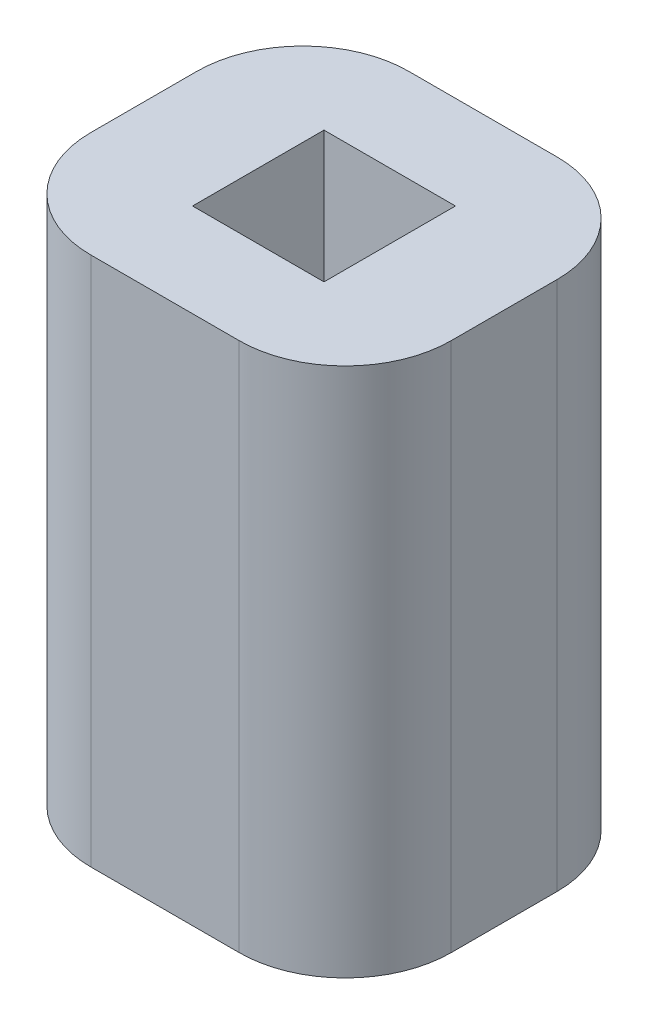
ISO-10303-21;
HEADER;
FILE_DESCRIPTION(('STEP AP214'),'2;1');
FILE_NAME('part.step','',(''),(''),'','','');
FILE_SCHEMA(('AUTOMOTIVE_DESIGN { 1 0 10303 214 1 1 1 1 }'));
ENDSEC;
DATA;
#1=APPLICATION_CONTEXT('core data for automotive mechanical design processes');
#2=APPLICATION_PROTOCOL_DEFINITION('international standard','automotive_design',2000,#1);
#3=PRODUCT_CONTEXT('',#1,'mechanical');
#4=PRODUCT('Part','Part','',(#3));
#5=PRODUCT_RELATED_PRODUCT_CATEGORY('part','',(#4));
#6=PRODUCT_DEFINITION_FORMATION('','',#4);
#7=PRODUCT_DEFINITION_CONTEXT('part definition',#1,'design');
#8=PRODUCT_DEFINITION('design','',#6,#7);
#9=PRODUCT_DEFINITION_SHAPE('','',#8);
#10=(LENGTH_UNIT() NAMED_UNIT(*) SI_UNIT(.MILLI.,.METRE.));
#11=(NAMED_UNIT(*) PLANE_ANGLE_UNIT() SI_UNIT($,.RADIAN.));
#12=(NAMED_UNIT(*) SI_UNIT($,.STERADIAN.) SOLID_ANGLE_UNIT());
#13=UNCERTAINTY_MEASURE_WITH_UNIT(LENGTH_MEASURE(1.E-05),#10,'distance_accuracy_value','');
#14=(GEOMETRIC_REPRESENTATION_CONTEXT(3) GLOBAL_UNCERTAINTY_ASSIGNED_CONTEXT((#13)) GLOBAL_UNIT_ASSIGNED_CONTEXT((#10,
#11,#12)) REPRESENTATION_CONTEXT('',''));
#15=CARTESIAN_POINT('',(0.,0.,0.));
#16=DIRECTION('',(0.,0.,1.));
#17=DIRECTION('',(1.,0.,0.));
#18=AXIS2_PLACEMENT_3D('',#15,#16,#17);
#19=CARTESIAN_POINT('',(65.5821861241737,51.9144925702467,15.));
#20=DIRECTION('',(-1.,0.,0.));
#21=DIRECTION('',(0.,0.,1.));
#22=AXIS2_PLACEMENT_3D('',#19,#20,#21);
#23=PLANE('',#22);
#24=DIRECTION('',(0.,0.,-1.));
#25=VECTOR('',#24,1.);
#26=CARTESIAN_POINT('',(65.5821861241737,26.9144925702467,15.));
#27=LINE('',#26,#25);
#28=CARTESIAN_POINT('',(65.5821861241737,26.9144925702467,10.));
#29=VERTEX_POINT('',#28);
#30=CARTESIAN_POINT('',(65.5821861241737,26.9144925702467,5.));
#31=VERTEX_POINT('',#30);
#32=EDGE_CURVE('E176',#29,#31,#27,.T.);
#33=ORIENTED_EDGE('',*,*,#32,.T.);
#34=DIRECTION('',(0.,1.,0.));
#35=VECTOR('',#34,1.);
#36=CARTESIAN_POINT('',(65.5821861241737,51.9144925702467,5.));
#37=LINE('',#36,#35);
#38=CARTESIAN_POINT('',(65.5821861241737,51.9144925702467,5.));
#39=VERTEX_POINT('',#38);
#40=EDGE_CURVE('E216',#31,#39,#37,.T.);
#41=ORIENTED_EDGE('',*,*,#40,.T.);
#42=DIRECTION('',(0.,0.,-1.));
#43=VECTOR('',#42,1.);
#44=CARTESIAN_POINT('',(65.5821861241737,51.9144925702467,15.));
#45=LINE('',#44,#43);
#46=CARTESIAN_POINT('',(65.5821861241737,51.9144925702467,10.));
#47=VERTEX_POINT('',#46);
#48=EDGE_CURVE('E189',#47,#39,#45,.T.);
#49=ORIENTED_EDGE('',*,*,#48,.F.);
#50=DIRECTION('',(0.,1.,0.));
#51=VECTOR('',#50,1.);
#52=CARTESIAN_POINT('',(65.5821861241737,26.9144925702467,10.));
#53=LINE('',#52,#51);
#54=EDGE_CURVE('E214',#47,#29,#53,.F.);
#55=ORIENTED_EDGE('',*,*,#54,.T.);
#56=EDGE_LOOP('',(#33,#41,#49,#55));
#57=FACE_BOUND('',#56,.T.);
#58=ADVANCED_FACE('F35',(#57),#23,.F.);
#59=CARTESIAN_POINT('',(48.5821861241737,51.9144925702467,15.));
#60=DIRECTION('',(0.,-1.,0.));
#61=DIRECTION('',(0.,0.,-1.));
#62=AXIS2_PLACEMENT_3D('',#59,#60,#61);
#63=PLANE('',#62);
#64=DIRECTION('',(0.,0.,1.));
#65=VECTOR('',#64,1.);
#66=CARTESIAN_POINT('',(53.9821861241737,51.9144925702467,4.4));
#67=LINE('',#66,#65);
#68=CARTESIAN_POINT('',(53.9821861241737,51.9144925702467,4.4));
#69=VERTEX_POINT('',#68);
#70=CARTESIAN_POINT('',(53.9821861241737,51.9144925702467,10.6));
#71=VERTEX_POINT('',#70);
#72=EDGE_CURVE('E142',#69,#71,#67,.T.);
#73=ORIENTED_EDGE('',*,*,#72,.F.);
#74=DIRECTION('',(-1.,0.,0.));
#75=VECTOR('',#74,1.);
#76=CARTESIAN_POINT('',(60.1821861241737,51.9144925702467,4.4));
#77=LINE('',#76,#75);
#78=CARTESIAN_POINT('',(60.1821861241737,51.9144925702467,4.4));
#79=VERTEX_POINT('',#78);
#80=EDGE_CURVE('E147',#79,#69,#77,.T.);
#81=ORIENTED_EDGE('',*,*,#80,.F.);
#82=DIRECTION('',(0.,0.,-1.));
#83=VECTOR('',#82,1.);
#84=CARTESIAN_POINT('',(60.1821861241737,51.9144925702467,10.6));
#85=LINE('',#84,#83);
#86=CARTESIAN_POINT('',(60.1821861241737,51.9144925702467,10.6));
#87=VERTEX_POINT('',#86);
#88=EDGE_CURVE('E151',#87,#79,#85,.T.);
#89=ORIENTED_EDGE('',*,*,#88,.F.);
#90=DIRECTION('',(1.,0.,0.));
#91=VECTOR('',#90,1.);
#92=CARTESIAN_POINT('',(53.9821861241737,51.9144925702467,10.6));
#93=LINE('',#92,#91);
#94=EDGE_CURVE('E131',#71,#87,#93,.T.);
#95=ORIENTED_EDGE('',*,*,#94,.F.);
#96=EDGE_LOOP('',(#73,#81,#89,#95));
#97=FACE_BOUND('',#96,.T.);
#98=DIRECTION('',(-1.,0.,0.));
#99=VECTOR('',#98,1.);
#100=CARTESIAN_POINT('',(48.5821861241737,51.9144925702467,0.));
#101=LINE('',#100,#99);
#102=CARTESIAN_POINT('',(60.5821861241737,51.9144925702467,0.));
#103=VERTEX_POINT('',#102);
#104=CARTESIAN_POINT('',(53.5821861241737,51.9144925702467,0.));
#105=VERTEX_POINT('',#104);
#106=EDGE_CURVE('E166',#103,#105,#101,.T.);
#107=ORIENTED_EDGE('',*,*,#106,.T.);
#108=CARTESIAN_POINT('',(53.5821861241737,51.9144925702467,5.));
#109=DIRECTION('',(0.,-1.,0.));
#110=DIRECTION('',(0.,0.,-1.));
#111=AXIS2_PLACEMENT_3D('',#108,#109,#110);
#112=CIRCLE('',#111,5.);
#113=CARTESIAN_POINT('',(48.5821861241737,51.9144925702467,5.));
#114=VERTEX_POINT('',#113);
#115=EDGE_CURVE('E212',#105,#114,#112,.F.);
#116=ORIENTED_EDGE('',*,*,#115,.T.);
#117=DIRECTION('',(0.,0.,-1.));
#118=VECTOR('',#117,1.);
#119=CARTESIAN_POINT('',(48.5821861241737,51.9144925702467,15.));
#120=LINE('',#119,#118);
#121=CARTESIAN_POINT('',(48.5821861241737,51.9144925702467,10.));
#122=VERTEX_POINT('',#121);
#123=EDGE_CURVE('E186',#122,#114,#120,.T.);
#124=ORIENTED_EDGE('',*,*,#123,.F.);
#125=CARTESIAN_POINT('',(53.5821861241737,51.9144925702467,10.));
#126=DIRECTION('',(0.,-1.,0.));
#127=DIRECTION('',(0.,0.,-1.));
#128=AXIS2_PLACEMENT_3D('',#125,#126,#127);
#129=CIRCLE('',#128,5.);
#130=CARTESIAN_POINT('',(53.5821861241737,51.9144925702467,15.));
#131=VERTEX_POINT('',#130);
#132=EDGE_CURVE('E209',#122,#131,#129,.F.);
#133=ORIENTED_EDGE('',*,*,#132,.T.);
#134=DIRECTION('',(-1.,0.,0.));
#135=VECTOR('',#134,1.);
#136=CARTESIAN_POINT('',(48.5821861241737,51.9144925702467,15.));
#137=LINE('',#136,#135);
#138=CARTESIAN_POINT('',(60.5821861241737,51.9144925702467,15.));
#139=VERTEX_POINT('',#138);
#140=EDGE_CURVE('E169',#139,#131,#137,.T.);
#141=ORIENTED_EDGE('',*,*,#140,.F.);
#142=CARTESIAN_POINT('',(60.5821861241737,51.9144925702467,10.));
#143=DIRECTION('',(0.,-1.,0.));
#144=DIRECTION('',(0.,0.,-1.));
#145=AXIS2_PLACEMENT_3D('',#142,#143,#144);
#146=CIRCLE('',#145,5.);
#147=EDGE_CURVE('E58',#139,#47,#146,.F.);
#148=ORIENTED_EDGE('',*,*,#147,.T.);
#149=ORIENTED_EDGE('',*,*,#48,.T.);
#150=CARTESIAN_POINT('',(60.5821861241737,51.9144925702467,5.));
#151=DIRECTION('',(0.,-1.,0.));
#152=DIRECTION('',(0.,0.,-1.));
#153=AXIS2_PLACEMENT_3D('',#150,#151,#152);
#154=CIRCLE('',#153,5.);
#155=EDGE_CURVE('E50',#39,#103,#154,.F.);
#156=ORIENTED_EDGE('',*,*,#155,.T.);
#157=EDGE_LOOP('',(#107,#116,#124,#133,#141,#148,#149,#156));
#158=FACE_BOUND('',#157,.T.);
#159=ADVANCED_FACE('F149',(#97,#158),#63,.F.);
#160=CARTESIAN_POINT('',(48.5821861241737,51.9144925702467,15.));
#161=DIRECTION('',(1.,0.,0.));
#162=DIRECTION('',(0.,0.,-1.));
#163=AXIS2_PLACEMENT_3D('',#160,#161,#162);
#164=PLANE('',#163);
#165=ORIENTED_EDGE('',*,*,#123,.T.);
#166=DIRECTION('',(0.,-1.,0.));
#167=VECTOR('',#166,1.);
#168=CARTESIAN_POINT('',(48.5821861241737,51.9144925702467,5.));
#169=LINE('',#168,#167);
#170=CARTESIAN_POINT('',(48.5821861241737,26.9144925702467,5.));
#171=VERTEX_POINT('',#170);
#172=EDGE_CURVE('E193',#114,#171,#169,.T.);
#173=ORIENTED_EDGE('',*,*,#172,.T.);
#174=DIRECTION('',(0.,0.,-1.));
#175=VECTOR('',#174,1.);
#176=CARTESIAN_POINT('',(48.5821861241737,26.9144925702467,15.));
#177=LINE('',#176,#175);
#178=CARTESIAN_POINT('',(48.5821861241737,26.9144925702467,10.));
#179=VERTEX_POINT('',#178);
#180=EDGE_CURVE('E183',#179,#171,#177,.T.);
#181=ORIENTED_EDGE('',*,*,#180,.F.);
#182=DIRECTION('',(0.,-1.,0.));
#183=VECTOR('',#182,1.);
#184=CARTESIAN_POINT('',(48.5821861241737,51.9144925702467,10.));
#185=LINE('',#184,#183);
#186=EDGE_CURVE('E191',#179,#122,#185,.F.);
#187=ORIENTED_EDGE('',*,*,#186,.T.);
#188=EDGE_LOOP('',(#165,#173,#181,#187));
#189=FACE_BOUND('',#188,.T.);
#190=ADVANCED_FACE('F248',(#189),#164,.F.);
#191=CARTESIAN_POINT('',(48.5821861241737,26.9144925702467,15.));
#192=DIRECTION('',(0.,1.,0.));
#193=DIRECTION('',(0.,0.,1.));
#194=AXIS2_PLACEMENT_3D('',#191,#192,#193);
#195=PLANE('',#194);
#196=DIRECTION('',(-1.,0.,0.));
#197=VECTOR('',#196,1.);
#198=CARTESIAN_POINT('',(53.9821861241737,26.9144925702467,10.6));
#199=LINE('',#198,#197);
#200=CARTESIAN_POINT('',(60.1821861241737,26.9144925702467,10.6));
#201=VERTEX_POINT('',#200);
#202=CARTESIAN_POINT('',(53.9821861241737,26.9144925702467,10.6));
#203=VERTEX_POINT('',#202);
#204=EDGE_CURVE('E134',#201,#203,#199,.T.);
#205=ORIENTED_EDGE('',*,*,#204,.F.);
#206=DIRECTION('',(0.,0.,1.));
#207=VECTOR('',#206,1.);
#208=CARTESIAN_POINT('',(60.1821861241737,26.9144925702467,4.4));
#209=LINE('',#208,#207);
#210=CARTESIAN_POINT('',(60.1821861241737,26.9144925702467,4.4));
#211=VERTEX_POINT('',#210);
#212=EDGE_CURVE('E153',#211,#201,#209,.T.);
#213=ORIENTED_EDGE('',*,*,#212,.F.);
#214=DIRECTION('',(1.,0.,0.));
#215=VECTOR('',#214,1.);
#216=CARTESIAN_POINT('',(53.9821861241737,26.9144925702467,4.4));
#217=LINE('',#216,#215);
#218=CARTESIAN_POINT('',(53.9821861241737,26.9144925702467,4.4));
#219=VERTEX_POINT('',#218);
#220=EDGE_CURVE('E161',#219,#211,#217,.T.);
#221=ORIENTED_EDGE('',*,*,#220,.F.);
#222=DIRECTION('',(0.,0.,-1.));
#223=VECTOR('',#222,1.);
#224=CARTESIAN_POINT('',(53.9821861241737,26.9144925702467,4.4));
#225=LINE('',#224,#223);
#226=EDGE_CURVE('E159',#203,#219,#225,.T.);
#227=ORIENTED_EDGE('',*,*,#226,.F.);
#228=EDGE_LOOP('',(#205,#213,#221,#227));
#229=FACE_BOUND('',#228,.T.);
#230=ORIENTED_EDGE('',*,*,#180,.T.);
#231=CARTESIAN_POINT('',(53.5821861241737,26.9144925702467,5.));
#232=DIRECTION('',(0.,1.,0.));
#233=DIRECTION('',(0.,0.,1.));
#234=AXIS2_PLACEMENT_3D('',#231,#232,#233);
#235=CIRCLE('',#234,5.);
#236=CARTESIAN_POINT('',(53.5821861241737,26.9144925702467,0.));
#237=VERTEX_POINT('',#236);
#238=EDGE_CURVE('E202',#171,#237,#235,.F.);
#239=ORIENTED_EDGE('',*,*,#238,.T.);
#240=DIRECTION('',(1.,0.,0.));
#241=VECTOR('',#240,1.);
#242=CARTESIAN_POINT('',(48.5821861241737,26.9144925702467,0.));
#243=LINE('',#242,#241);
#244=CARTESIAN_POINT('',(60.5821861241737,26.9144925702467,0.));
#245=VERTEX_POINT('',#244);
#246=EDGE_CURVE('E173',#237,#245,#243,.T.);
#247=ORIENTED_EDGE('',*,*,#246,.T.);
#248=CARTESIAN_POINT('',(60.5821861241737,26.9144925702467,5.));
#249=DIRECTION('',(0.,1.,0.));
#250=DIRECTION('',(0.,0.,1.));
#251=AXIS2_PLACEMENT_3D('',#248,#249,#250);
#252=CIRCLE('',#251,5.);
#253=EDGE_CURVE('E200',#245,#31,#252,.F.);
#254=ORIENTED_EDGE('',*,*,#253,.T.);
#255=ORIENTED_EDGE('',*,*,#32,.F.);
#256=CARTESIAN_POINT('',(60.5821861241737,26.9144925702467,10.));
#257=DIRECTION('',(0.,1.,0.));
#258=DIRECTION('',(0.,0.,1.));
#259=AXIS2_PLACEMENT_3D('',#256,#257,#258);
#260=CIRCLE('',#259,5.);
#261=CARTESIAN_POINT('',(60.5821861241737,26.9144925702467,15.));
#262=VERTEX_POINT('',#261);
#263=EDGE_CURVE('E196',#29,#262,#260,.F.);
#264=ORIENTED_EDGE('',*,*,#263,.T.);
#265=DIRECTION('',(1.,0.,0.));
#266=VECTOR('',#265,1.);
#267=CARTESIAN_POINT('',(48.5821861241737,26.9144925702467,15.));
#268=LINE('',#267,#266);
#269=CARTESIAN_POINT('',(53.5821861241737,26.9144925702467,15.));
#270=VERTEX_POINT('',#269);
#271=EDGE_CURVE('E172',#270,#262,#268,.T.);
#272=ORIENTED_EDGE('',*,*,#271,.F.);
#273=CARTESIAN_POINT('',(53.5821861241737,26.9144925702467,10.));
#274=DIRECTION('',(0.,1.,0.));
#275=DIRECTION('',(0.,0.,1.));
#276=AXIS2_PLACEMENT_3D('',#273,#274,#275);
#277=CIRCLE('',#276,5.);
#278=EDGE_CURVE('E198',#270,#179,#277,.F.);
#279=ORIENTED_EDGE('',*,*,#278,.T.);
#280=EDGE_LOOP('',(#230,#239,#247,#254,#255,#264,#272,#279));
#281=FACE_BOUND('',#280,.T.);
#282=ADVANCED_FACE('F231',(#229,#281),#195,.F.);
#283=CARTESIAN_POINT('',(0.,0.,15.));
#284=DIRECTION('',(0.,0.,1.));
#285=DIRECTION('',(1.,0.,0.));
#286=AXIS2_PLACEMENT_3D('',#283,#284,#285);
#287=PLANE('',#286);
#288=ORIENTED_EDGE('',*,*,#140,.T.);
#289=DIRECTION('',(0.,-1.,0.));
#290=VECTOR('',#289,1.);
#291=CARTESIAN_POINT('',(53.5821861241737,26.9144925702467,15.));
#292=LINE('',#291,#290);
#293=EDGE_CURVE('E11',#131,#270,#292,.T.);
#294=ORIENTED_EDGE('',*,*,#293,.T.);
#295=ORIENTED_EDGE('',*,*,#271,.T.);
#296=DIRECTION('',(0.,1.,0.));
#297=VECTOR('',#296,1.);
#298=CARTESIAN_POINT('',(60.5821861241737,51.9144925702467,15.));
#299=LINE('',#298,#297);
#300=EDGE_CURVE('E43',#262,#139,#299,.T.);
#301=ORIENTED_EDGE('',*,*,#300,.T.);
#302=EDGE_LOOP('',(#288,#294,#295,#301));
#303=FACE_BOUND('',#302,.T.);
#304=ADVANCED_FACE('F220',(#303),#287,.T.);
#305=CARTESIAN_POINT('',(0.,0.,0.));
#306=DIRECTION('',(0.,0.,1.));
#307=DIRECTION('',(1.,0.,0.));
#308=AXIS2_PLACEMENT_3D('',#305,#306,#307);
#309=PLANE('',#308);
#310=ORIENTED_EDGE('',*,*,#246,.F.);
#311=DIRECTION('',(0.,-1.,0.));
#312=VECTOR('',#311,1.);
#313=CARTESIAN_POINT('',(53.5821861241737,0.,0.));
#314=LINE('',#313,#312);
#315=EDGE_CURVE('E206',#237,#105,#314,.F.);
#316=ORIENTED_EDGE('',*,*,#315,.T.);
#317=ORIENTED_EDGE('',*,*,#106,.F.);
#318=DIRECTION('',(0.,1.,0.));
#319=VECTOR('',#318,1.);
#320=CARTESIAN_POINT('',(60.5821861241737,0.,0.));
#321=LINE('',#320,#319);
#322=EDGE_CURVE('E204',#103,#245,#321,.F.);
#323=ORIENTED_EDGE('',*,*,#322,.T.);
#324=EDGE_LOOP('',(#310,#316,#317,#323));
#325=FACE_BOUND('',#324,.T.);
#326=ADVANCED_FACE('F240',(#325),#309,.F.);
#327=CARTESIAN_POINT('',(60.1821861241737,30.1644925702467,4.4));
#328=DIRECTION('',(1.,0.,0.));
#329=DIRECTION('',(0.,0.,-1.));
#330=AXIS2_PLACEMENT_3D('',#327,#328,#329);
#331=PLANE('',#330);
#332=ORIENTED_EDGE('',*,*,#212,.T.);
#333=DIRECTION('',(0.,-1.,0.));
#334=VECTOR('',#333,1.);
#335=CARTESIAN_POINT('',(60.1821861241737,30.1644925702467,10.6));
#336=LINE('',#335,#334);
#337=EDGE_CURVE('E139',#87,#201,#336,.T.);
#338=ORIENTED_EDGE('',*,*,#337,.F.);
#339=ORIENTED_EDGE('',*,*,#88,.T.);
#340=DIRECTION('',(0.,-1.,0.));
#341=VECTOR('',#340,1.);
#342=CARTESIAN_POINT('',(60.1821861241737,30.1644925702467,4.4));
#343=LINE('',#342,#341);
#344=EDGE_CURVE('E164',#79,#211,#343,.T.);
#345=ORIENTED_EDGE('',*,*,#344,.T.);
#346=EDGE_LOOP('',(#332,#338,#339,#345));
#347=FACE_BOUND('',#346,.T.);
#348=ADVANCED_FACE('F281',(#347),#331,.F.);
#349=CARTESIAN_POINT('',(53.9821861241737,30.1644925702467,4.4));
#350=DIRECTION('',(0.,0.,-1.));
#351=DIRECTION('',(-1.,0.,0.));
#352=AXIS2_PLACEMENT_3D('',#349,#350,#351);
#353=PLANE('',#352);
#354=ORIENTED_EDGE('',*,*,#220,.T.);
#355=ORIENTED_EDGE('',*,*,#344,.F.);
#356=ORIENTED_EDGE('',*,*,#80,.T.);
#357=DIRECTION('',(0.,-1.,0.));
#358=VECTOR('',#357,1.);
#359=CARTESIAN_POINT('',(53.9821861241737,30.1644925702467,4.4));
#360=LINE('',#359,#358);
#361=EDGE_CURVE('E138',#69,#219,#360,.T.);
#362=ORIENTED_EDGE('',*,*,#361,.T.);
#363=EDGE_LOOP('',(#354,#355,#356,#362));
#364=FACE_BOUND('',#363,.T.);
#365=ADVANCED_FACE('F286',(#364),#353,.F.);
#366=CARTESIAN_POINT('',(53.9821861241737,30.1644925702467,4.4));
#367=DIRECTION('',(-1.,0.,0.));
#368=DIRECTION('',(0.,0.,1.));
#369=AXIS2_PLACEMENT_3D('',#366,#367,#368);
#370=PLANE('',#369);
#371=ORIENTED_EDGE('',*,*,#226,.T.);
#372=ORIENTED_EDGE('',*,*,#361,.F.);
#373=ORIENTED_EDGE('',*,*,#72,.T.);
#374=DIRECTION('',(0.,-1.,0.));
#375=VECTOR('',#374,1.);
#376=CARTESIAN_POINT('',(53.9821861241737,30.1644925702467,10.6));
#377=LINE('',#376,#375);
#378=EDGE_CURVE('E126',#71,#203,#377,.T.);
#379=ORIENTED_EDGE('',*,*,#378,.T.);
#380=EDGE_LOOP('',(#371,#372,#373,#379));
#381=FACE_BOUND('',#380,.T.);
#382=ADVANCED_FACE('F143',(#381),#370,.F.);
#383=CARTESIAN_POINT('',(53.9821861241737,30.1644925702467,10.6));
#384=DIRECTION('',(0.,0.,1.));
#385=DIRECTION('',(1.,0.,0.));
#386=AXIS2_PLACEMENT_3D('',#383,#384,#385);
#387=PLANE('',#386);
#388=ORIENTED_EDGE('',*,*,#204,.T.);
#389=ORIENTED_EDGE('',*,*,#378,.F.);
#390=ORIENTED_EDGE('',*,*,#94,.T.);
#391=ORIENTED_EDGE('',*,*,#337,.T.);
#392=EDGE_LOOP('',(#388,#389,#390,#391));
#393=FACE_BOUND('',#392,.T.);
#394=ADVANCED_FACE('F128',(#393),#387,.F.);
#395=CARTESIAN_POINT('',(53.5821861241737,51.9144925702467,5.));
#396=DIRECTION('',(0.,-1.,0.));
#397=DIRECTION('',(0.,0.,-1.));
#398=AXIS2_PLACEMENT_3D('',#395,#396,#397);
#399=CYLINDRICAL_SURFACE('',#398,5.);
#400=ORIENTED_EDGE('',*,*,#115,.F.);
#401=ORIENTED_EDGE('',*,*,#315,.F.);
#402=ORIENTED_EDGE('',*,*,#238,.F.);
#403=ORIENTED_EDGE('',*,*,#172,.F.);
#404=EDGE_LOOP('',(#400,#401,#402,#403));
#405=FACE_BOUND('',#404,.T.);
#406=ADVANCED_FACE('F245',(#405),#399,.T.);
#407=CARTESIAN_POINT('',(60.5821861241737,51.9144925702467,5.));
#408=DIRECTION('',(0.,1.,0.));
#409=DIRECTION('',(0.,0.,1.));
#410=AXIS2_PLACEMENT_3D('',#407,#408,#409);
#411=CYLINDRICAL_SURFACE('',#410,5.);
#412=ORIENTED_EDGE('',*,*,#253,.F.);
#413=ORIENTED_EDGE('',*,*,#322,.F.);
#414=ORIENTED_EDGE('',*,*,#155,.F.);
#415=ORIENTED_EDGE('',*,*,#40,.F.);
#416=EDGE_LOOP('',(#412,#413,#414,#415));
#417=FACE_BOUND('',#416,.T.);
#418=ADVANCED_FACE('F243',(#417),#411,.T.);
#419=CARTESIAN_POINT('',(53.5821861241737,0.,10.));
#420=DIRECTION('',(0.,1.,0.));
#421=DIRECTION('',(0.,0.,1.));
#422=AXIS2_PLACEMENT_3D('',#419,#420,#421);
#423=CYLINDRICAL_SURFACE('',#422,5.);
#424=ORIENTED_EDGE('',*,*,#132,.F.);
#425=ORIENTED_EDGE('',*,*,#186,.F.);
#426=ORIENTED_EDGE('',*,*,#278,.F.);
#427=ORIENTED_EDGE('',*,*,#293,.F.);
#428=EDGE_LOOP('',(#424,#425,#426,#427));
#429=FACE_BOUND('',#428,.T.);
#430=ADVANCED_FACE('F229',(#429),#423,.T.);
#431=CARTESIAN_POINT('',(60.5821861241737,0.,10.));
#432=DIRECTION('',(0.,-1.,0.));
#433=DIRECTION('',(0.,0.,-1.));
#434=AXIS2_PLACEMENT_3D('',#431,#432,#433);
#435=CYLINDRICAL_SURFACE('',#434,5.);
#436=ORIENTED_EDGE('',*,*,#263,.F.);
#437=ORIENTED_EDGE('',*,*,#54,.F.);
#438=ORIENTED_EDGE('',*,*,#147,.F.);
#439=ORIENTED_EDGE('',*,*,#300,.F.);
#440=EDGE_LOOP('',(#436,#437,#438,#439));
#441=FACE_BOUND('',#440,.T.);
#442=ADVANCED_FACE('F37',(#441),#435,.T.);
#443=CLOSED_SHELL('',(#58,#159,#190,#282,#304,#326,#348,#365,#382,#394,#406,#418,#430,#442));
#444=MANIFOLD_SOLID_BREP('B2',#443);
#445=ADVANCED_BREP_SHAPE_REPRESENTATION('',(#18,#444),#14);
#446=SHAPE_DEFINITION_REPRESENTATION(#9,#445);
ENDSEC;
END-ISO-10303-21;
